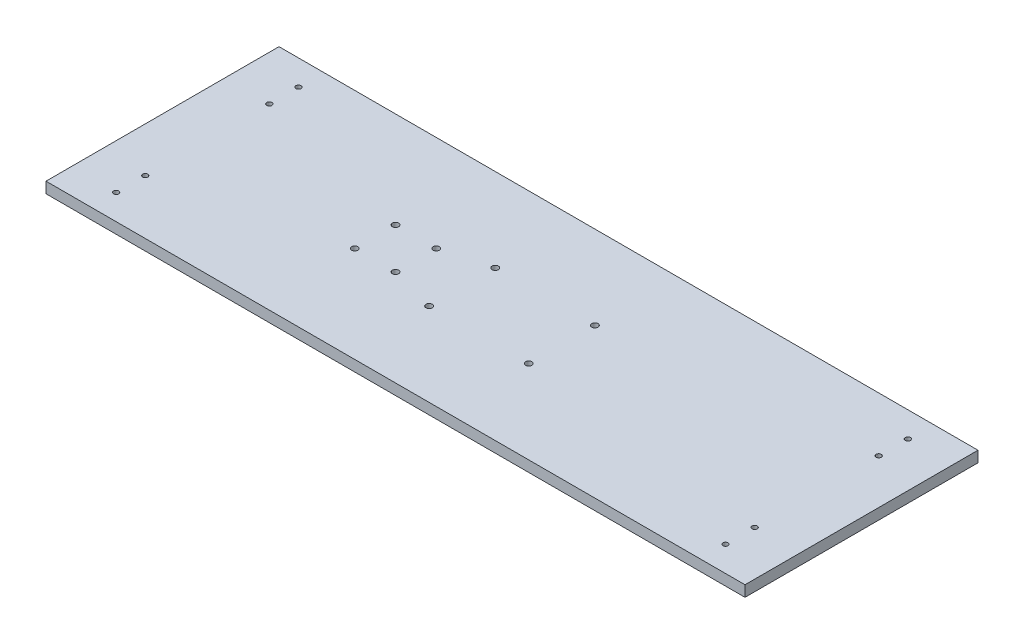
ISO-10303-21;
HEADER;
FILE_DESCRIPTION(('STEP AP214'),'2;1');
FILE_NAME('part.step','',(''),(''),'','','');
FILE_SCHEMA(('AUTOMOTIVE_DESIGN { 1 0 10303 214 1 1 1 1 }'));
ENDSEC;
DATA;
#1=APPLICATION_CONTEXT('core data for automotive mechanical design processes');
#2=APPLICATION_PROTOCOL_DEFINITION('international standard','automotive_design',2000,#1);
#3=PRODUCT_CONTEXT('',#1,'mechanical');
#4=PRODUCT('Part','Part','',(#3));
#5=PRODUCT_RELATED_PRODUCT_CATEGORY('part','',(#4));
#6=PRODUCT_DEFINITION_FORMATION('','',#4);
#7=PRODUCT_DEFINITION_CONTEXT('part definition',#1,'design');
#8=PRODUCT_DEFINITION('design','',#6,#7);
#9=PRODUCT_DEFINITION_SHAPE('','',#8);
#10=(LENGTH_UNIT() NAMED_UNIT(*) SI_UNIT(.MILLI.,.METRE.));
#11=(NAMED_UNIT(*) PLANE_ANGLE_UNIT() SI_UNIT($,.RADIAN.));
#12=(NAMED_UNIT(*) SI_UNIT($,.STERADIAN.) SOLID_ANGLE_UNIT());
#13=UNCERTAINTY_MEASURE_WITH_UNIT(LENGTH_MEASURE(1.E-05),#10,'distance_accuracy_value','');
#14=(GEOMETRIC_REPRESENTATION_CONTEXT(3) GLOBAL_UNCERTAINTY_ASSIGNED_CONTEXT((#13)) GLOBAL_UNIT_ASSIGNED_CONTEXT((#10,
#11,#12)) REPRESENTATION_CONTEXT('',''));
#15=CARTESIAN_POINT('',(0.,0.,0.));
#16=DIRECTION('',(0.,0.,1.));
#17=DIRECTION('',(1.,0.,0.));
#18=AXIS2_PLACEMENT_3D('',#15,#16,#17);
#19=CARTESIAN_POINT('',(0.,0.,0.));
#20=DIRECTION('',(0.,-1.,0.));
#21=DIRECTION('',(0.,0.,-1.));
#22=AXIS2_PLACEMENT_3D('',#19,#20,#21);
#23=PLANE('',#22);
#24=CARTESIAN_POINT('',(570.5221,0.,-155.702));
#25=DIRECTION('',(0.,1.,0.));
#26=DIRECTION('',(0.,0.,1.));
#27=AXIS2_PLACEMENT_3D('',#24,#25,#26);
#28=CIRCLE('',#27,2.24999999999997);
#29=CARTESIAN_POINT('',(570.5221,0.,-153.452));
#30=VERTEX_POINT('',#29);
#31=EDGE_CURVE('E194',#30,#30,#28,.T.);
#32=ORIENTED_EDGE('',*,*,#31,.T.);
#33=EDGE_LOOP('',(#32));
#34=FACE_BOUND('',#33,.T.);
#35=CARTESIAN_POINT('',(39.0779,0.,-47.498));
#36=DIRECTION('',(0.,1.,0.));
#37=DIRECTION('',(0.,0.,1.));
#38=AXIS2_PLACEMENT_3D('',#35,#36,#37);
#39=CIRCLE('',#38,2.25);
#40=CARTESIAN_POINT('',(39.0779,0.,-45.248));
#41=VERTEX_POINT('',#40);
#42=EDGE_CURVE('E164',#41,#41,#39,.T.);
#43=ORIENTED_EDGE('',*,*,#42,.T.);
#44=EDGE_LOOP('',(#43));
#45=FACE_BOUND('',#44,.T.);
#46=CARTESIAN_POINT('',(39.0779,0.,-22.098));
#47=DIRECTION('',(0.,1.,0.));
#48=DIRECTION('',(0.,0.,1.));
#49=AXIS2_PLACEMENT_3D('',#46,#47,#48);
#50=CIRCLE('',#49,2.25);
#51=CARTESIAN_POINT('',(39.0779,0.,-19.848));
#52=VERTEX_POINT('',#51);
#53=EDGE_CURVE('E158',#52,#52,#50,.T.);
#54=ORIENTED_EDGE('',*,*,#53,.T.);
#55=EDGE_LOOP('',(#54));
#56=FACE_BOUND('',#55,.T.);
#57=CARTESIAN_POINT('',(185.42,0.,-119.38));
#58=DIRECTION('',(0.,1.,0.));
#59=DIRECTION('',(0.,0.,1.));
#60=AXIS2_PLACEMENT_3D('',#57,#58,#59);
#61=CIRCLE('',#60,2.75);
#62=CARTESIAN_POINT('',(185.42,0.,-116.63));
#63=VERTEX_POINT('',#62);
#64=EDGE_CURVE('E152',#63,#63,#61,.T.);
#65=ORIENTED_EDGE('',*,*,#64,.T.);
#66=EDGE_LOOP('',(#65));
#67=FACE_BOUND('',#66,.T.);
#68=CARTESIAN_POINT('',(220.98,0.,-119.38));
#69=DIRECTION('',(0.,1.,0.));
#70=DIRECTION('',(0.,0.,1.));
#71=AXIS2_PLACEMENT_3D('',#68,#69,#70);
#72=CIRCLE('',#71,2.75);
#73=CARTESIAN_POINT('',(220.98,0.,-116.63));
#74=VERTEX_POINT('',#73);
#75=EDGE_CURVE('E146',#74,#74,#72,.T.);
#76=ORIENTED_EDGE('',*,*,#75,.T.);
#77=EDGE_LOOP('',(#76));
#78=FACE_BOUND('',#77,.T.);
#79=CARTESIAN_POINT('',(220.98,0.,-83.82));
#80=DIRECTION('',(0.,1.,0.));
#81=DIRECTION('',(0.,0.,1.));
#82=AXIS2_PLACEMENT_3D('',#79,#80,#81);
#83=CIRCLE('',#82,2.75);
#84=CARTESIAN_POINT('',(220.98,0.,-81.07));
#85=VERTEX_POINT('',#84);
#86=EDGE_CURVE('E140',#85,#85,#83,.T.);
#87=ORIENTED_EDGE('',*,*,#86,.T.);
#88=EDGE_LOOP('',(#87));
#89=FACE_BOUND('',#88,.T.);
#90=CARTESIAN_POINT('',(185.42,0.,-83.82));
#91=DIRECTION('',(0.,1.,0.));
#92=DIRECTION('',(0.,0.,1.));
#93=AXIS2_PLACEMENT_3D('',#90,#91,#92);
#94=CIRCLE('',#93,2.75);
#95=CARTESIAN_POINT('',(185.42,0.,-81.07));
#96=VERTEX_POINT('',#95);
#97=EDGE_CURVE('E134',#96,#96,#94,.T.);
#98=ORIENTED_EDGE('',*,*,#97,.T.);
#99=EDGE_LOOP('',(#98));
#100=FACE_BOUND('',#99,.T.);
#101=CARTESIAN_POINT('',(261.366,0.,-130.429));
#102=DIRECTION('',(0.,1.,0.));
#103=DIRECTION('',(0.,0.,1.));
#104=AXIS2_PLACEMENT_3D('',#101,#102,#103);
#105=CIRCLE('',#104,2.74999999999997);
#106=CARTESIAN_POINT('',(261.366,0.,-127.679));
#107=VERTEX_POINT('',#106);
#108=EDGE_CURVE('E128',#107,#107,#105,.T.);
#109=ORIENTED_EDGE('',*,*,#108,.T.);
#110=EDGE_LOOP('',(#109));
#111=FACE_BOUND('',#110,.T.);
#112=CARTESIAN_POINT('',(348.234,0.,-130.429));
#113=DIRECTION('',(0.,1.,0.));
#114=DIRECTION('',(0.,0.,1.));
#115=AXIS2_PLACEMENT_3D('',#112,#113,#114);
#116=CIRCLE('',#115,2.74999999999997);
#117=CARTESIAN_POINT('',(348.234,0.,-127.679));
#118=VERTEX_POINT('',#117);
#119=EDGE_CURVE('E122',#118,#118,#116,.T.);
#120=ORIENTED_EDGE('',*,*,#119,.T.);
#121=EDGE_LOOP('',(#120));
#122=FACE_BOUND('',#121,.T.);
#123=CARTESIAN_POINT('',(348.234,0.,-72.771));
#124=DIRECTION('',(0.,1.,0.));
#125=DIRECTION('',(0.,0.,1.));
#126=AXIS2_PLACEMENT_3D('',#123,#124,#125);
#127=CIRCLE('',#126,2.74999999999997);
#128=CARTESIAN_POINT('',(348.234,0.,-70.021));
#129=VERTEX_POINT('',#128);
#130=EDGE_CURVE('E116',#129,#129,#127,.T.);
#131=ORIENTED_EDGE('',*,*,#130,.T.);
#132=EDGE_LOOP('',(#131));
#133=FACE_BOUND('',#132,.T.);
#134=CARTESIAN_POINT('',(261.366,0.,-72.771));
#135=DIRECTION('',(0.,1.,0.));
#136=DIRECTION('',(0.,0.,1.));
#137=AXIS2_PLACEMENT_3D('',#134,#135,#136);
#138=CIRCLE('',#137,2.74999999999997);
#139=CARTESIAN_POINT('',(261.366,0.,-70.021));
#140=VERTEX_POINT('',#139);
#141=EDGE_CURVE('E100',#140,#140,#138,.T.);
#142=ORIENTED_EDGE('',*,*,#141,.T.);
#143=EDGE_LOOP('',(#142));
#144=FACE_BOUND('',#143,.T.);
#145=DIRECTION('',(0.,0.,1.));
#146=VECTOR('',#145,1.);
#147=CARTESIAN_POINT('',(0.,0.,0.));
#148=LINE('',#147,#146);
#149=CARTESIAN_POINT('',(0.,0.,-203.2));
#150=VERTEX_POINT('',#149);
#151=CARTESIAN_POINT('',(0.,0.,0.));
#152=VERTEX_POINT('',#151);
#153=EDGE_CURVE('E97',#150,#152,#148,.T.);
#154=ORIENTED_EDGE('',*,*,#153,.F.);
#155=DIRECTION('',(-1.,0.,0.));
#156=VECTOR('',#155,1.);
#157=CARTESIAN_POINT('',(0.,0.,-203.2));
#158=LINE('',#157,#156);
#159=CARTESIAN_POINT('',(609.6,0.,-203.2));
#160=VERTEX_POINT('',#159);
#161=EDGE_CURVE('E72',#160,#150,#158,.T.);
#162=ORIENTED_EDGE('',*,*,#161,.F.);
#163=DIRECTION('',(0.,0.,-1.));
#164=VECTOR('',#163,1.);
#165=CARTESIAN_POINT('',(609.6,0.,0.));
#166=LINE('',#165,#164);
#167=CARTESIAN_POINT('',(609.6,0.,0.));
#168=VERTEX_POINT('',#167);
#169=EDGE_CURVE('E66',#168,#160,#166,.T.);
#170=ORIENTED_EDGE('',*,*,#169,.F.);
#171=DIRECTION('',(1.,0.,0.));
#172=VECTOR('',#171,1.);
#173=CARTESIAN_POINT('',(0.,0.,0.));
#174=LINE('',#173,#172);
#175=EDGE_CURVE('E89',#152,#168,#174,.T.);
#176=ORIENTED_EDGE('',*,*,#175,.F.);
#177=EDGE_LOOP('',(#154,#162,#170,#176));
#178=FACE_BOUND('',#177,.T.);
#179=CARTESIAN_POINT('',(39.0779,0.,-155.702));
#180=DIRECTION('',(0.,1.,0.));
#181=DIRECTION('',(0.,0.,1.));
#182=AXIS2_PLACEMENT_3D('',#179,#180,#181);
#183=CIRCLE('',#182,2.25);
#184=CARTESIAN_POINT('',(39.0779,0.,-153.452));
#185=VERTEX_POINT('',#184);
#186=EDGE_CURVE('E170',#185,#185,#183,.T.);
#187=ORIENTED_EDGE('',*,*,#186,.T.);
#188=EDGE_LOOP('',(#187));
#189=FACE_BOUND('',#188,.T.);
#190=CARTESIAN_POINT('',(39.0779,0.,-181.102));
#191=DIRECTION('',(0.,1.,0.));
#192=DIRECTION('',(0.,0.,1.));
#193=AXIS2_PLACEMENT_3D('',#190,#191,#192);
#194=CIRCLE('',#193,2.25);
#195=CARTESIAN_POINT('',(39.0779,0.,-178.852));
#196=VERTEX_POINT('',#195);
#197=EDGE_CURVE('E176',#196,#196,#194,.T.);
#198=ORIENTED_EDGE('',*,*,#197,.T.);
#199=EDGE_LOOP('',(#198));
#200=FACE_BOUND('',#199,.T.);
#201=CARTESIAN_POINT('',(570.5221,0.,-22.098));
#202=DIRECTION('',(0.,1.,0.));
#203=DIRECTION('',(0.,0.,1.));
#204=AXIS2_PLACEMENT_3D('',#201,#202,#203);
#205=CIRCLE('',#204,2.24999999999997);
#206=CARTESIAN_POINT('',(570.5221,0.,-19.848));
#207=VERTEX_POINT('',#206);
#208=EDGE_CURVE('E182',#207,#207,#205,.T.);
#209=ORIENTED_EDGE('',*,*,#208,.T.);
#210=EDGE_LOOP('',(#209));
#211=FACE_BOUND('',#210,.T.);
#212=CARTESIAN_POINT('',(570.5221,0.,-47.498));
#213=DIRECTION('',(0.,1.,0.));
#214=DIRECTION('',(0.,0.,1.));
#215=AXIS2_PLACEMENT_3D('',#212,#213,#214);
#216=CIRCLE('',#215,2.24999999999997);
#217=CARTESIAN_POINT('',(570.5221,0.,-45.248));
#218=VERTEX_POINT('',#217);
#219=EDGE_CURVE('E188',#218,#218,#216,.T.);
#220=ORIENTED_EDGE('',*,*,#219,.T.);
#221=EDGE_LOOP('',(#220));
#222=FACE_BOUND('',#221,.T.);
#223=CARTESIAN_POINT('',(570.5221,0.,-181.102));
#224=DIRECTION('',(0.,1.,0.));
#225=DIRECTION('',(0.,0.,1.));
#226=AXIS2_PLACEMENT_3D('',#223,#224,#225);
#227=CIRCLE('',#226,2.24999999999997);
#228=CARTESIAN_POINT('',(570.5221,0.,-178.852));
#229=VERTEX_POINT('',#228);
#230=EDGE_CURVE('E200',#229,#229,#227,.T.);
#231=ORIENTED_EDGE('',*,*,#230,.T.);
#232=EDGE_LOOP('',(#231));
#233=FACE_BOUND('',#232,.T.);
#234=ADVANCED_FACE('F32',(#34,#45,#56,#67,#78,#89,#100,#111,#122,#133,#144,#178,#189,#200,#211,
#222,#233),#23,.T.);
#235=CARTESIAN_POINT('',(0.,9.525,0.));
#236=DIRECTION('',(0.,-1.,0.));
#237=DIRECTION('',(0.,0.,-1.));
#238=AXIS2_PLACEMENT_3D('',#235,#236,#237);
#239=PLANE('',#238);
#240=CARTESIAN_POINT('',(570.5221,9.525,-47.498));
#241=DIRECTION('',(0.,1.,0.));
#242=DIRECTION('',(0.,0.,1.));
#243=AXIS2_PLACEMENT_3D('',#240,#241,#242);
#244=CIRCLE('',#243,2.24999999999997);
#245=CARTESIAN_POINT('',(570.5221,9.525,-45.248));
#246=VERTEX_POINT('',#245);
#247=EDGE_CURVE('E191',#246,#246,#244,.T.);
#248=ORIENTED_EDGE('',*,*,#247,.F.);
#249=EDGE_LOOP('',(#248));
#250=FACE_BOUND('',#249,.T.);
#251=CARTESIAN_POINT('',(570.5221,9.525,-22.098));
#252=DIRECTION('',(0.,1.,0.));
#253=DIRECTION('',(0.,0.,1.));
#254=AXIS2_PLACEMENT_3D('',#251,#252,#253);
#255=CIRCLE('',#254,2.24999999999997);
#256=CARTESIAN_POINT('',(570.5221,9.525,-19.848));
#257=VERTEX_POINT('',#256);
#258=EDGE_CURVE('E185',#257,#257,#255,.T.);
#259=ORIENTED_EDGE('',*,*,#258,.F.);
#260=EDGE_LOOP('',(#259));
#261=FACE_BOUND('',#260,.T.);
#262=CARTESIAN_POINT('',(39.0779,9.525,-181.102));
#263=DIRECTION('',(0.,1.,0.));
#264=DIRECTION('',(0.,0.,1.));
#265=AXIS2_PLACEMENT_3D('',#262,#263,#264);
#266=CIRCLE('',#265,2.25);
#267=CARTESIAN_POINT('',(39.0779,9.525,-178.852));
#268=VERTEX_POINT('',#267);
#269=EDGE_CURVE('E179',#268,#268,#266,.T.);
#270=ORIENTED_EDGE('',*,*,#269,.F.);
#271=EDGE_LOOP('',(#270));
#272=FACE_BOUND('',#271,.T.);
#273=CARTESIAN_POINT('',(39.0779,9.525,-155.702));
#274=DIRECTION('',(0.,1.,0.));
#275=DIRECTION('',(0.,0.,1.));
#276=AXIS2_PLACEMENT_3D('',#273,#274,#275);
#277=CIRCLE('',#276,2.25);
#278=CARTESIAN_POINT('',(39.0779,9.525,-153.452));
#279=VERTEX_POINT('',#278);
#280=EDGE_CURVE('E173',#279,#279,#277,.T.);
#281=ORIENTED_EDGE('',*,*,#280,.F.);
#282=EDGE_LOOP('',(#281));
#283=FACE_BOUND('',#282,.T.);
#284=CARTESIAN_POINT('',(39.0779,9.525,-47.498));
#285=DIRECTION('',(0.,1.,0.));
#286=DIRECTION('',(0.,0.,1.));
#287=AXIS2_PLACEMENT_3D('',#284,#285,#286);
#288=CIRCLE('',#287,2.25);
#289=CARTESIAN_POINT('',(39.0779,9.525,-45.248));
#290=VERTEX_POINT('',#289);
#291=EDGE_CURVE('E167',#290,#290,#288,.T.);
#292=ORIENTED_EDGE('',*,*,#291,.F.);
#293=EDGE_LOOP('',(#292));
#294=FACE_BOUND('',#293,.T.);
#295=CARTESIAN_POINT('',(39.0779,9.525,-22.098));
#296=DIRECTION('',(0.,1.,0.));
#297=DIRECTION('',(0.,0.,1.));
#298=AXIS2_PLACEMENT_3D('',#295,#296,#297);
#299=CIRCLE('',#298,2.25);
#300=CARTESIAN_POINT('',(39.0779,9.525,-19.848));
#301=VERTEX_POINT('',#300);
#302=EDGE_CURVE('E161',#301,#301,#299,.T.);
#303=ORIENTED_EDGE('',*,*,#302,.F.);
#304=EDGE_LOOP('',(#303));
#305=FACE_BOUND('',#304,.T.);
#306=CARTESIAN_POINT('',(185.42,9.525,-119.38));
#307=DIRECTION('',(0.,1.,0.));
#308=DIRECTION('',(0.,0.,1.));
#309=AXIS2_PLACEMENT_3D('',#306,#307,#308);
#310=CIRCLE('',#309,2.75);
#311=CARTESIAN_POINT('',(185.42,9.525,-116.63));
#312=VERTEX_POINT('',#311);
#313=EDGE_CURVE('E155',#312,#312,#310,.T.);
#314=ORIENTED_EDGE('',*,*,#313,.F.);
#315=EDGE_LOOP('',(#314));
#316=FACE_BOUND('',#315,.T.);
#317=CARTESIAN_POINT('',(220.98,9.525,-119.38));
#318=DIRECTION('',(0.,1.,0.));
#319=DIRECTION('',(0.,0.,1.));
#320=AXIS2_PLACEMENT_3D('',#317,#318,#319);
#321=CIRCLE('',#320,2.74999999999997);
#322=CARTESIAN_POINT('',(220.98,9.525,-116.63));
#323=VERTEX_POINT('',#322);
#324=EDGE_CURVE('E149',#323,#323,#321,.T.);
#325=ORIENTED_EDGE('',*,*,#324,.F.);
#326=EDGE_LOOP('',(#325));
#327=FACE_BOUND('',#326,.T.);
#328=CARTESIAN_POINT('',(220.98,9.525,-83.82));
#329=DIRECTION('',(0.,1.,0.));
#330=DIRECTION('',(0.,0.,1.));
#331=AXIS2_PLACEMENT_3D('',#328,#329,#330);
#332=CIRCLE('',#331,2.74999999999997);
#333=CARTESIAN_POINT('',(220.98,9.525,-81.07));
#334=VERTEX_POINT('',#333);
#335=EDGE_CURVE('E143',#334,#334,#332,.T.);
#336=ORIENTED_EDGE('',*,*,#335,.F.);
#337=EDGE_LOOP('',(#336));
#338=FACE_BOUND('',#337,.T.);
#339=CARTESIAN_POINT('',(261.366,9.525,-130.429));
#340=DIRECTION('',(0.,1.,0.));
#341=DIRECTION('',(0.,0.,1.));
#342=AXIS2_PLACEMENT_3D('',#339,#340,#341);
#343=CIRCLE('',#342,2.74999999999997);
#344=CARTESIAN_POINT('',(261.366,9.525,-127.679));
#345=VERTEX_POINT('',#344);
#346=EDGE_CURVE('E131',#345,#345,#343,.T.);
#347=ORIENTED_EDGE('',*,*,#346,.F.);
#348=EDGE_LOOP('',(#347));
#349=FACE_BOUND('',#348,.T.);
#350=CARTESIAN_POINT('',(348.234,9.525,-130.429));
#351=DIRECTION('',(0.,1.,0.));
#352=DIRECTION('',(0.,0.,1.));
#353=AXIS2_PLACEMENT_3D('',#350,#351,#352);
#354=CIRCLE('',#353,2.74999999999997);
#355=CARTESIAN_POINT('',(348.234,9.525,-127.679));
#356=VERTEX_POINT('',#355);
#357=EDGE_CURVE('E125',#356,#356,#354,.T.);
#358=ORIENTED_EDGE('',*,*,#357,.F.);
#359=EDGE_LOOP('',(#358));
#360=FACE_BOUND('',#359,.T.);
#361=CARTESIAN_POINT('',(348.234,9.525,-72.771));
#362=DIRECTION('',(0.,1.,0.));
#363=DIRECTION('',(0.,0.,1.));
#364=AXIS2_PLACEMENT_3D('',#361,#362,#363);
#365=CIRCLE('',#364,2.74999999999997);
#366=CARTESIAN_POINT('',(348.234,9.525,-70.021));
#367=VERTEX_POINT('',#366);
#368=EDGE_CURVE('E119',#367,#367,#365,.T.);
#369=ORIENTED_EDGE('',*,*,#368,.F.);
#370=EDGE_LOOP('',(#369));
#371=FACE_BOUND('',#370,.T.);
#372=CARTESIAN_POINT('',(261.366,9.525,-72.771));
#373=DIRECTION('',(0.,1.,0.));
#374=DIRECTION('',(0.,0.,1.));
#375=AXIS2_PLACEMENT_3D('',#372,#373,#374);
#376=CIRCLE('',#375,2.74999999999997);
#377=CARTESIAN_POINT('',(261.366,9.525,-70.021));
#378=VERTEX_POINT('',#377);
#379=EDGE_CURVE('E113',#378,#378,#376,.T.);
#380=ORIENTED_EDGE('',*,*,#379,.F.);
#381=EDGE_LOOP('',(#380));
#382=FACE_BOUND('',#381,.T.);
#383=DIRECTION('',(0.,0.,1.));
#384=VECTOR('',#383,1.);
#385=CARTESIAN_POINT('',(0.,9.525,0.));
#386=LINE('',#385,#384);
#387=CARTESIAN_POINT('',(0.,9.525,-203.2));
#388=VERTEX_POINT('',#387);
#389=CARTESIAN_POINT('',(0.,9.525,0.));
#390=VERTEX_POINT('',#389);
#391=EDGE_CURVE('E85',#388,#390,#386,.T.);
#392=ORIENTED_EDGE('',*,*,#391,.T.);
#393=DIRECTION('',(1.,0.,0.));
#394=VECTOR('',#393,1.);
#395=CARTESIAN_POINT('',(0.,9.525,0.));
#396=LINE('',#395,#394);
#397=CARTESIAN_POINT('',(609.6,9.525,0.));
#398=VERTEX_POINT('',#397);
#399=EDGE_CURVE('E79',#390,#398,#396,.T.);
#400=ORIENTED_EDGE('',*,*,#399,.T.);
#401=DIRECTION('',(0.,0.,-1.));
#402=VECTOR('',#401,1.);
#403=CARTESIAN_POINT('',(609.6,9.525,0.));
#404=LINE('',#403,#402);
#405=CARTESIAN_POINT('',(609.6,9.525,-203.2));
#406=VERTEX_POINT('',#405);
#407=EDGE_CURVE('E83',#398,#406,#404,.T.);
#408=ORIENTED_EDGE('',*,*,#407,.T.);
#409=DIRECTION('',(-1.,0.,0.));
#410=VECTOR('',#409,1.);
#411=CARTESIAN_POINT('',(0.,9.525,-203.2));
#412=LINE('',#411,#410);
#413=EDGE_CURVE('E49',#406,#388,#412,.T.);
#414=ORIENTED_EDGE('',*,*,#413,.T.);
#415=EDGE_LOOP('',(#392,#400,#408,#414));
#416=FACE_BOUND('',#415,.T.);
#417=CARTESIAN_POINT('',(185.42,9.525,-83.82));
#418=DIRECTION('',(0.,1.,0.));
#419=DIRECTION('',(0.,0.,1.));
#420=AXIS2_PLACEMENT_3D('',#417,#418,#419);
#421=CIRCLE('',#420,2.75);
#422=CARTESIAN_POINT('',(185.42,9.525,-81.07));
#423=VERTEX_POINT('',#422);
#424=EDGE_CURVE('E137',#423,#423,#421,.T.);
#425=ORIENTED_EDGE('',*,*,#424,.F.);
#426=EDGE_LOOP('',(#425));
#427=FACE_BOUND('',#426,.T.);
#428=CARTESIAN_POINT('',(570.5221,9.525,-155.702));
#429=DIRECTION('',(0.,1.,0.));
#430=DIRECTION('',(0.,0.,1.));
#431=AXIS2_PLACEMENT_3D('',#428,#429,#430);
#432=CIRCLE('',#431,2.24999999999997);
#433=CARTESIAN_POINT('',(570.5221,9.525,-153.452));
#434=VERTEX_POINT('',#433);
#435=EDGE_CURVE('E197',#434,#434,#432,.T.);
#436=ORIENTED_EDGE('',*,*,#435,.F.);
#437=EDGE_LOOP('',(#436));
#438=FACE_BOUND('',#437,.T.);
#439=CARTESIAN_POINT('',(570.5221,9.525,-181.102));
#440=DIRECTION('',(0.,1.,0.));
#441=DIRECTION('',(0.,0.,1.));
#442=AXIS2_PLACEMENT_3D('',#439,#440,#441);
#443=CIRCLE('',#442,2.24999999999997);
#444=CARTESIAN_POINT('',(570.5221,9.525,-178.852));
#445=VERTEX_POINT('',#444);
#446=EDGE_CURVE('E203',#445,#445,#443,.T.);
#447=ORIENTED_EDGE('',*,*,#446,.F.);
#448=EDGE_LOOP('',(#447));
#449=FACE_BOUND('',#448,.T.);
#450=ADVANCED_FACE('F80',(#250,#261,#272,#283,#294,#305,#316,#327,#338,#349,#360,#371,#382,#416,
#427,#438,#449),#239,.F.);
#451=CARTESIAN_POINT('',(0.,9.525,0.));
#452=DIRECTION('',(1.,0.,0.));
#453=DIRECTION('',(0.,0.,-1.));
#454=AXIS2_PLACEMENT_3D('',#451,#452,#453);
#455=PLANE('',#454);
#456=ORIENTED_EDGE('',*,*,#153,.T.);
#457=DIRECTION('',(0.,-1.,0.));
#458=VECTOR('',#457,1.);
#459=CARTESIAN_POINT('',(0.,9.525,0.));
#460=LINE('',#459,#458);
#461=EDGE_CURVE('E11',#390,#152,#460,.T.);
#462=ORIENTED_EDGE('',*,*,#461,.F.);
#463=ORIENTED_EDGE('',*,*,#391,.F.);
#464=DIRECTION('',(0.,-1.,0.));
#465=VECTOR('',#464,1.);
#466=CARTESIAN_POINT('',(0.,9.525,-203.2));
#467=LINE('',#466,#465);
#468=EDGE_CURVE('E93',#388,#150,#467,.T.);
#469=ORIENTED_EDGE('',*,*,#468,.T.);
#470=EDGE_LOOP('',(#456,#462,#463,#469));
#471=FACE_BOUND('',#470,.T.);
#472=ADVANCED_FACE('F34',(#471),#455,.F.);
#473=CARTESIAN_POINT('',(0.,9.525,0.));
#474=DIRECTION('',(0.,0.,-1.));
#475=DIRECTION('',(-1.,0.,0.));
#476=AXIS2_PLACEMENT_3D('',#473,#474,#475);
#477=PLANE('',#476);
#478=ORIENTED_EDGE('',*,*,#175,.T.);
#479=DIRECTION('',(0.,-1.,0.));
#480=VECTOR('',#479,1.);
#481=CARTESIAN_POINT('',(609.6,9.525,0.));
#482=LINE('',#481,#480);
#483=EDGE_CURVE('E41',#398,#168,#482,.T.);
#484=ORIENTED_EDGE('',*,*,#483,.F.);
#485=ORIENTED_EDGE('',*,*,#399,.F.);
#486=ORIENTED_EDGE('',*,*,#461,.T.);
#487=EDGE_LOOP('',(#478,#484,#485,#486));
#488=FACE_BOUND('',#487,.T.);
#489=ADVANCED_FACE('F88',(#488),#477,.F.);
#490=CARTESIAN_POINT('',(609.6,9.525,0.));
#491=DIRECTION('',(-1.,0.,0.));
#492=DIRECTION('',(0.,0.,1.));
#493=AXIS2_PLACEMENT_3D('',#490,#491,#492);
#494=PLANE('',#493);
#495=ORIENTED_EDGE('',*,*,#169,.T.);
#496=DIRECTION('',(0.,-1.,0.));
#497=VECTOR('',#496,1.);
#498=CARTESIAN_POINT('',(609.6,9.525,-203.2));
#499=LINE('',#498,#497);
#500=EDGE_CURVE('E90',#406,#160,#499,.T.);
#501=ORIENTED_EDGE('',*,*,#500,.F.);
#502=ORIENTED_EDGE('',*,*,#407,.F.);
#503=ORIENTED_EDGE('',*,*,#483,.T.);
#504=EDGE_LOOP('',(#495,#501,#502,#503));
#505=FACE_BOUND('',#504,.T.);
#506=ADVANCED_FACE('F91',(#505),#494,.F.);
#507=CARTESIAN_POINT('',(0.,9.525,-203.2));
#508=DIRECTION('',(0.,0.,1.));
#509=DIRECTION('',(1.,0.,0.));
#510=AXIS2_PLACEMENT_3D('',#507,#508,#509);
#511=PLANE('',#510);
#512=ORIENTED_EDGE('',*,*,#161,.T.);
#513=ORIENTED_EDGE('',*,*,#468,.F.);
#514=ORIENTED_EDGE('',*,*,#413,.F.);
#515=ORIENTED_EDGE('',*,*,#500,.T.);
#516=EDGE_LOOP('',(#512,#513,#514,#515));
#517=FACE_BOUND('',#516,.T.);
#518=ADVANCED_FACE('F105',(#517),#511,.F.);
#519=CARTESIAN_POINT('',(261.366,9.525,-72.771));
#520=DIRECTION('',(0.,1.,0.));
#521=DIRECTION('',(0.,0.,1.));
#522=AXIS2_PLACEMENT_3D('',#519,#520,#521);
#523=CYLINDRICAL_SURFACE('',#522,2.74999999999997);
#524=ORIENTED_EDGE('',*,*,#141,.F.);
#525=EDGE_LOOP('',(#524));
#526=FACE_BOUND('',#525,.T.);
#527=ORIENTED_EDGE('',*,*,#379,.T.);
#528=EDGE_LOOP('',(#527));
#529=FACE_BOUND('',#528,.T.);
#530=ADVANCED_FACE('F221',(#526,#529),#523,.F.);
#531=CARTESIAN_POINT('',(348.234,9.525,-72.771));
#532=DIRECTION('',(0.,1.,0.));
#533=DIRECTION('',(0.,0.,1.));
#534=AXIS2_PLACEMENT_3D('',#531,#532,#533);
#535=CYLINDRICAL_SURFACE('',#534,2.74999999999997);
#536=ORIENTED_EDGE('',*,*,#130,.F.);
#537=EDGE_LOOP('',(#536));
#538=FACE_BOUND('',#537,.T.);
#539=ORIENTED_EDGE('',*,*,#368,.T.);
#540=EDGE_LOOP('',(#539));
#541=FACE_BOUND('',#540,.T.);
#542=ADVANCED_FACE('F246',(#538,#541),#535,.F.);
#543=CARTESIAN_POINT('',(348.234,9.525,-130.429));
#544=DIRECTION('',(0.,1.,0.));
#545=DIRECTION('',(0.,0.,1.));
#546=AXIS2_PLACEMENT_3D('',#543,#544,#545);
#547=CYLINDRICAL_SURFACE('',#546,2.74999999999997);
#548=ORIENTED_EDGE('',*,*,#119,.F.);
#549=EDGE_LOOP('',(#548));
#550=FACE_BOUND('',#549,.T.);
#551=ORIENTED_EDGE('',*,*,#357,.T.);
#552=EDGE_LOOP('',(#551));
#553=FACE_BOUND('',#552,.T.);
#554=ADVANCED_FACE('F253',(#550,#553),#547,.F.);
#555=CARTESIAN_POINT('',(261.366,9.525,-130.429));
#556=DIRECTION('',(0.,1.,0.));
#557=DIRECTION('',(0.,0.,1.));
#558=AXIS2_PLACEMENT_3D('',#555,#556,#557);
#559=CYLINDRICAL_SURFACE('',#558,2.74999999999997);
#560=ORIENTED_EDGE('',*,*,#108,.F.);
#561=EDGE_LOOP('',(#560));
#562=FACE_BOUND('',#561,.T.);
#563=ORIENTED_EDGE('',*,*,#346,.T.);
#564=EDGE_LOOP('',(#563));
#565=FACE_BOUND('',#564,.T.);
#566=ADVANCED_FACE('F260',(#562,#565),#559,.F.);
#567=CARTESIAN_POINT('',(185.42,9.525,-83.82));
#568=DIRECTION('',(0.,1.,0.));
#569=DIRECTION('',(0.,0.,1.));
#570=AXIS2_PLACEMENT_3D('',#567,#568,#569);
#571=CYLINDRICAL_SURFACE('',#570,2.75);
#572=ORIENTED_EDGE('',*,*,#97,.F.);
#573=EDGE_LOOP('',(#572));
#574=FACE_BOUND('',#573,.T.);
#575=ORIENTED_EDGE('',*,*,#424,.T.);
#576=EDGE_LOOP('',(#575));
#577=FACE_BOUND('',#576,.T.);
#578=ADVANCED_FACE('F268',(#574,#577),#571,.F.);
#579=CARTESIAN_POINT('',(220.98,9.525,-83.82));
#580=DIRECTION('',(0.,1.,0.));
#581=DIRECTION('',(0.,0.,1.));
#582=AXIS2_PLACEMENT_3D('',#579,#580,#581);
#583=CYLINDRICAL_SURFACE('',#582,2.74999999999999);
#584=ORIENTED_EDGE('',*,*,#86,.F.);
#585=EDGE_LOOP('',(#584));
#586=FACE_BOUND('',#585,.T.);
#587=ORIENTED_EDGE('',*,*,#335,.T.);
#588=EDGE_LOOP('',(#587));
#589=FACE_BOUND('',#588,.T.);
#590=ADVANCED_FACE('F276',(#586,#589),#583,.F.);
#591=CARTESIAN_POINT('',(220.98,9.525,-119.38));
#592=DIRECTION('',(0.,1.,0.));
#593=DIRECTION('',(0.,0.,1.));
#594=AXIS2_PLACEMENT_3D('',#591,#592,#593);
#595=CYLINDRICAL_SURFACE('',#594,2.74999999999999);
#596=ORIENTED_EDGE('',*,*,#75,.F.);
#597=EDGE_LOOP('',(#596));
#598=FACE_BOUND('',#597,.T.);
#599=ORIENTED_EDGE('',*,*,#324,.T.);
#600=EDGE_LOOP('',(#599));
#601=FACE_BOUND('',#600,.T.);
#602=ADVANCED_FACE('F284',(#598,#601),#595,.F.);
#603=CARTESIAN_POINT('',(185.42,9.525,-119.38));
#604=DIRECTION('',(0.,1.,0.));
#605=DIRECTION('',(0.,0.,1.));
#606=AXIS2_PLACEMENT_3D('',#603,#604,#605);
#607=CYLINDRICAL_SURFACE('',#606,2.75);
#608=ORIENTED_EDGE('',*,*,#64,.F.);
#609=EDGE_LOOP('',(#608));
#610=FACE_BOUND('',#609,.T.);
#611=ORIENTED_EDGE('',*,*,#313,.T.);
#612=EDGE_LOOP('',(#611));
#613=FACE_BOUND('',#612,.T.);
#614=ADVANCED_FACE('F292',(#610,#613),#607,.F.);
#615=CARTESIAN_POINT('',(39.0779,9.525,-22.098));
#616=DIRECTION('',(0.,1.,0.));
#617=DIRECTION('',(0.,0.,1.));
#618=AXIS2_PLACEMENT_3D('',#615,#616,#617);
#619=CYLINDRICAL_SURFACE('',#618,2.25);
#620=ORIENTED_EDGE('',*,*,#53,.F.);
#621=EDGE_LOOP('',(#620));
#622=FACE_BOUND('',#621,.T.);
#623=ORIENTED_EDGE('',*,*,#302,.T.);
#624=EDGE_LOOP('',(#623));
#625=FACE_BOUND('',#624,.T.);
#626=ADVANCED_FACE('F300',(#622,#625),#619,.F.);
#627=CARTESIAN_POINT('',(39.0779,9.525,-47.498));
#628=DIRECTION('',(0.,1.,0.));
#629=DIRECTION('',(0.,0.,1.));
#630=AXIS2_PLACEMENT_3D('',#627,#628,#629);
#631=CYLINDRICAL_SURFACE('',#630,2.25);
#632=ORIENTED_EDGE('',*,*,#42,.F.);
#633=EDGE_LOOP('',(#632));
#634=FACE_BOUND('',#633,.T.);
#635=ORIENTED_EDGE('',*,*,#291,.T.);
#636=EDGE_LOOP('',(#635));
#637=FACE_BOUND('',#636,.T.);
#638=ADVANCED_FACE('F308',(#634,#637),#631,.F.);
#639=CARTESIAN_POINT('',(39.0779,9.525,-155.702));
#640=DIRECTION('',(0.,1.,0.));
#641=DIRECTION('',(0.,0.,1.));
#642=AXIS2_PLACEMENT_3D('',#639,#640,#641);
#643=CYLINDRICAL_SURFACE('',#642,2.25);
#644=ORIENTED_EDGE('',*,*,#186,.F.);
#645=EDGE_LOOP('',(#644));
#646=FACE_BOUND('',#645,.T.);
#647=ORIENTED_EDGE('',*,*,#280,.T.);
#648=EDGE_LOOP('',(#647));
#649=FACE_BOUND('',#648,.T.);
#650=ADVANCED_FACE('F316',(#646,#649),#643,.F.);
#651=CARTESIAN_POINT('',(39.0779,9.525,-181.102));
#652=DIRECTION('',(0.,1.,0.));
#653=DIRECTION('',(0.,0.,1.));
#654=AXIS2_PLACEMENT_3D('',#651,#652,#653);
#655=CYLINDRICAL_SURFACE('',#654,2.25);
#656=ORIENTED_EDGE('',*,*,#197,.F.);
#657=EDGE_LOOP('',(#656));
#658=FACE_BOUND('',#657,.T.);
#659=ORIENTED_EDGE('',*,*,#269,.T.);
#660=EDGE_LOOP('',(#659));
#661=FACE_BOUND('',#660,.T.);
#662=ADVANCED_FACE('F324',(#658,#661),#655,.F.);
#663=CARTESIAN_POINT('',(570.5221,9.525,-22.098));
#664=DIRECTION('',(0.,1.,0.));
#665=DIRECTION('',(0.,0.,1.));
#666=AXIS2_PLACEMENT_3D('',#663,#664,#665);
#667=CYLINDRICAL_SURFACE('',#666,2.24999999999997);
#668=ORIENTED_EDGE('',*,*,#208,.F.);
#669=EDGE_LOOP('',(#668));
#670=FACE_BOUND('',#669,.T.);
#671=ORIENTED_EDGE('',*,*,#258,.T.);
#672=EDGE_LOOP('',(#671));
#673=FACE_BOUND('',#672,.T.);
#674=ADVANCED_FACE('F332',(#670,#673),#667,.F.);
#675=CARTESIAN_POINT('',(570.5221,9.525,-47.498));
#676=DIRECTION('',(0.,1.,0.));
#677=DIRECTION('',(0.,0.,1.));
#678=AXIS2_PLACEMENT_3D('',#675,#676,#677);
#679=CYLINDRICAL_SURFACE('',#678,2.24999999999997);
#680=ORIENTED_EDGE('',*,*,#219,.F.);
#681=EDGE_LOOP('',(#680));
#682=FACE_BOUND('',#681,.T.);
#683=ORIENTED_EDGE('',*,*,#247,.T.);
#684=EDGE_LOOP('',(#683));
#685=FACE_BOUND('',#684,.T.);
#686=ADVANCED_FACE('F341',(#682,#685),#679,.F.);
#687=CARTESIAN_POINT('',(570.5221,9.525,-155.702));
#688=DIRECTION('',(0.,1.,0.));
#689=DIRECTION('',(0.,0.,1.));
#690=AXIS2_PLACEMENT_3D('',#687,#688,#689);
#691=CYLINDRICAL_SURFACE('',#690,2.24999999999997);
#692=ORIENTED_EDGE('',*,*,#31,.F.);
#693=EDGE_LOOP('',(#692));
#694=FACE_BOUND('',#693,.T.);
#695=ORIENTED_EDGE('',*,*,#435,.T.);
#696=EDGE_LOOP('',(#695));
#697=FACE_BOUND('',#696,.T.);
#698=ADVANCED_FACE('F349',(#694,#697),#691,.F.);
#699=CARTESIAN_POINT('',(570.5221,9.525,-181.102));
#700=DIRECTION('',(0.,1.,0.));
#701=DIRECTION('',(0.,0.,1.));
#702=AXIS2_PLACEMENT_3D('',#699,#700,#701);
#703=CYLINDRICAL_SURFACE('',#702,2.24999999999997);
#704=ORIENTED_EDGE('',*,*,#230,.F.);
#705=EDGE_LOOP('',(#704));
#706=FACE_BOUND('',#705,.T.);
#707=ORIENTED_EDGE('',*,*,#446,.T.);
#708=EDGE_LOOP('',(#707));
#709=FACE_BOUND('',#708,.T.);
#710=ADVANCED_FACE('F207',(#706,#709),#703,.F.);
#711=CLOSED_SHELL('',(#234,#450,#472,#489,#506,#518,#530,#542,#554,#566,#578,#590,#602,#614,
#626,#638,#650,#662,#674,#686,#698,#710));
#712=MANIFOLD_SOLID_BREP('B2',#711);
#713=ADVANCED_BREP_SHAPE_REPRESENTATION('',(#18,#712),#14);
#714=SHAPE_DEFINITION_REPRESENTATION(#9,#713);
ENDSEC;
END-ISO-10303-21;
